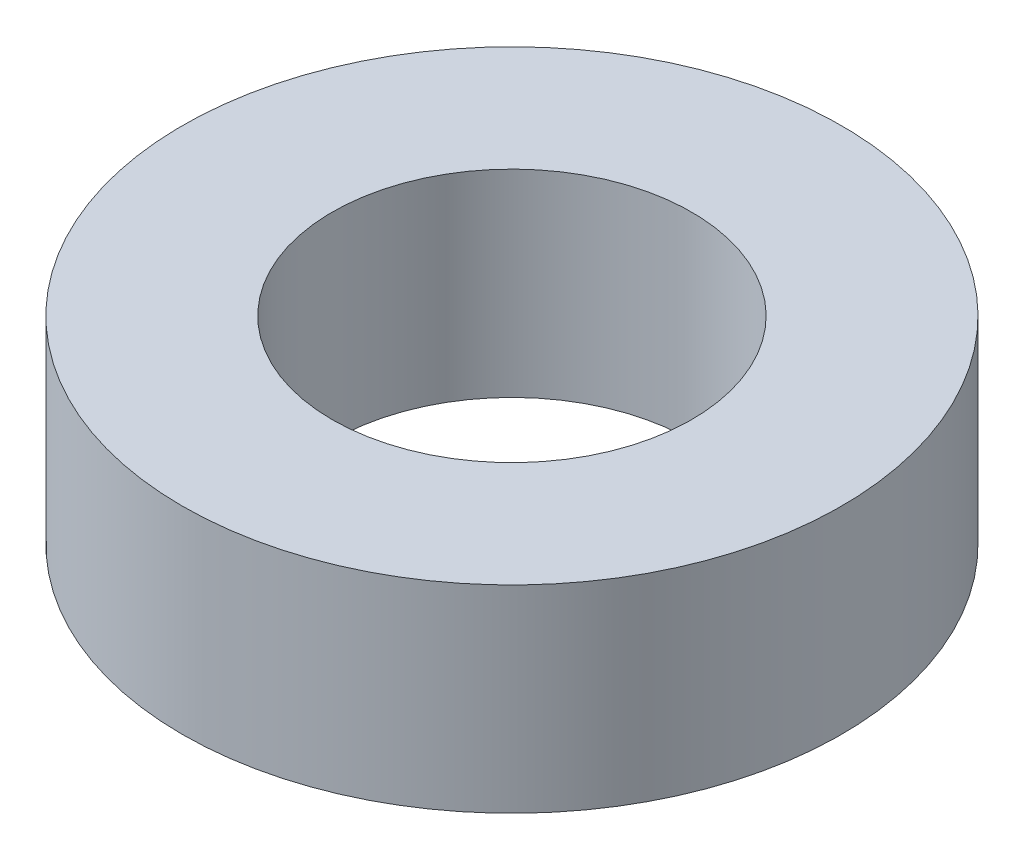
ISO-10303-21;
HEADER;
FILE_DESCRIPTION(('STEP AP214'),'2;1');
FILE_NAME('part.step','',(''),(''),'','','');
FILE_SCHEMA(('AUTOMOTIVE_DESIGN { 1 0 10303 214 1 1 1 1 }'));
ENDSEC;
DATA;
#1=APPLICATION_CONTEXT('core data for automotive mechanical design processes');
#2=APPLICATION_PROTOCOL_DEFINITION('international standard','automotive_design',2000,#1);
#3=PRODUCT_CONTEXT('',#1,'mechanical');
#4=PRODUCT('Part','Part','',(#3));
#5=PRODUCT_RELATED_PRODUCT_CATEGORY('part','',(#4));
#6=PRODUCT_DEFINITION_FORMATION('','',#4);
#7=PRODUCT_DEFINITION_CONTEXT('part definition',#1,'design');
#8=PRODUCT_DEFINITION('design','',#6,#7);
#9=PRODUCT_DEFINITION_SHAPE('','',#8);
#10=(LENGTH_UNIT() NAMED_UNIT(*) SI_UNIT(.MILLI.,.METRE.));
#11=(NAMED_UNIT(*) PLANE_ANGLE_UNIT() SI_UNIT($,.RADIAN.));
#12=(NAMED_UNIT(*) SI_UNIT($,.STERADIAN.) SOLID_ANGLE_UNIT());
#13=UNCERTAINTY_MEASURE_WITH_UNIT(LENGTH_MEASURE(1.E-05),#10,'distance_accuracy_value','');
#14=(GEOMETRIC_REPRESENTATION_CONTEXT(3) GLOBAL_UNCERTAINTY_ASSIGNED_CONTEXT((#13)) GLOBAL_UNIT_ASSIGNED_CONTEXT((#10,
#11,#12)) REPRESENTATION_CONTEXT('',''));
#15=CARTESIAN_POINT('',(0.,0.,0.));
#16=DIRECTION('',(0.,0.,1.));
#17=DIRECTION('',(1.,0.,0.));
#18=AXIS2_PLACEMENT_3D('',#15,#16,#17);
#19=CARTESIAN_POINT('',(0.,6.6,0.));
#20=DIRECTION('',(0.,1.,0.));
#21=DIRECTION('',(0.,0.,1.));
#22=AXIS2_PLACEMENT_3D('',#19,#20,#21);
#23=PLANE('',#22);
#24=CARTESIAN_POINT('',(0.,6.6,0.));
#25=DIRECTION('',(0.,1.,0.));
#26=DIRECTION('',(0.,0.,1.));
#27=AXIS2_PLACEMENT_3D('',#24,#25,#26);
#28=CIRCLE('',#27,11.);
#29=CARTESIAN_POINT('',(0.,6.6,11.));
#30=VERTEX_POINT('',#29);
#31=EDGE_CURVE('E10',#30,#30,#28,.T.);
#32=ORIENTED_EDGE('',*,*,#31,.T.);
#33=EDGE_LOOP('',(#32));
#34=FACE_BOUND('',#33,.T.);
#35=CARTESIAN_POINT('',(0.,6.6,0.));
#36=DIRECTION('',(0.,1.,0.));
#37=DIRECTION('',(0.,0.,1.));
#38=AXIS2_PLACEMENT_3D('',#35,#36,#37);
#39=CIRCLE('',#38,6.);
#40=CARTESIAN_POINT('',(0.,6.6,6.));
#41=VERTEX_POINT('',#40);
#42=EDGE_CURVE('E50',#41,#41,#39,.T.);
#43=ORIENTED_EDGE('',*,*,#42,.F.);
#44=EDGE_LOOP('',(#43));
#45=FACE_BOUND('',#44,.T.);
#46=ADVANCED_FACE('F37',(#34,#45),#23,.T.);
#47=CARTESIAN_POINT('',(0.,0.,0.));
#48=DIRECTION('',(0.,1.,0.));
#49=DIRECTION('',(0.,0.,1.));
#50=AXIS2_PLACEMENT_3D('',#47,#48,#49);
#51=PLANE('',#50);
#52=CARTESIAN_POINT('',(0.,0.,0.));
#53=DIRECTION('',(0.,1.,0.));
#54=DIRECTION('',(0.,0.,1.));
#55=AXIS2_PLACEMENT_3D('',#52,#53,#54);
#56=CIRCLE('',#55,11.);
#57=CARTESIAN_POINT('',(0.,0.,11.));
#58=VERTEX_POINT('',#57);
#59=EDGE_CURVE('E41',#58,#58,#56,.T.);
#60=ORIENTED_EDGE('',*,*,#59,.F.);
#61=EDGE_LOOP('',(#60));
#62=FACE_BOUND('',#61,.T.);
#63=CARTESIAN_POINT('',(0.,0.,0.));
#64=DIRECTION('',(0.,1.,0.));
#65=DIRECTION('',(0.,0.,1.));
#66=AXIS2_PLACEMENT_3D('',#63,#64,#65);
#67=CIRCLE('',#66,6.);
#68=CARTESIAN_POINT('',(0.,0.,6.));
#69=VERTEX_POINT('',#68);
#70=EDGE_CURVE('E52',#69,#69,#67,.T.);
#71=ORIENTED_EDGE('',*,*,#70,.T.);
#72=EDGE_LOOP('',(#71));
#73=FACE_BOUND('',#72,.T.);
#74=ADVANCED_FACE('F64',(#62,#73),#51,.F.);
#75=CARTESIAN_POINT('',(0.,6.6,0.));
#76=DIRECTION('',(0.,-1.,0.));
#77=DIRECTION('',(0.,0.,-1.));
#78=AXIS2_PLACEMENT_3D('',#75,#76,#77);
#79=CYLINDRICAL_SURFACE('',#78,11.);
#80=ORIENTED_EDGE('',*,*,#31,.F.);
#81=EDGE_LOOP('',(#80));
#82=FACE_BOUND('',#81,.T.);
#83=ORIENTED_EDGE('',*,*,#59,.T.);
#84=EDGE_LOOP('',(#83));
#85=FACE_BOUND('',#84,.T.);
#86=ADVANCED_FACE('F39',(#82,#85),#79,.T.);
#87=CARTESIAN_POINT('',(0.,6.6,0.));
#88=DIRECTION('',(0.,-1.,0.));
#89=DIRECTION('',(0.,0.,-1.));
#90=AXIS2_PLACEMENT_3D('',#87,#88,#89);
#91=CYLINDRICAL_SURFACE('',#90,6.);
#92=ORIENTED_EDGE('',*,*,#42,.T.);
#93=EDGE_LOOP('',(#92));
#94=FACE_BOUND('',#93,.T.);
#95=ORIENTED_EDGE('',*,*,#70,.F.);
#96=EDGE_LOOP('',(#95));
#97=FACE_BOUND('',#96,.T.);
#98=ADVANCED_FACE('F60',(#94,#97),#91,.F.);
#99=CLOSED_SHELL('',(#46,#74,#86,#98));
#100=MANIFOLD_SOLID_BREP('B2',#99);
#101=ADVANCED_BREP_SHAPE_REPRESENTATION('',(#18,#100),#14);
#102=SHAPE_DEFINITION_REPRESENTATION(#9,#101);
ENDSEC;
END-ISO-10303-21;
